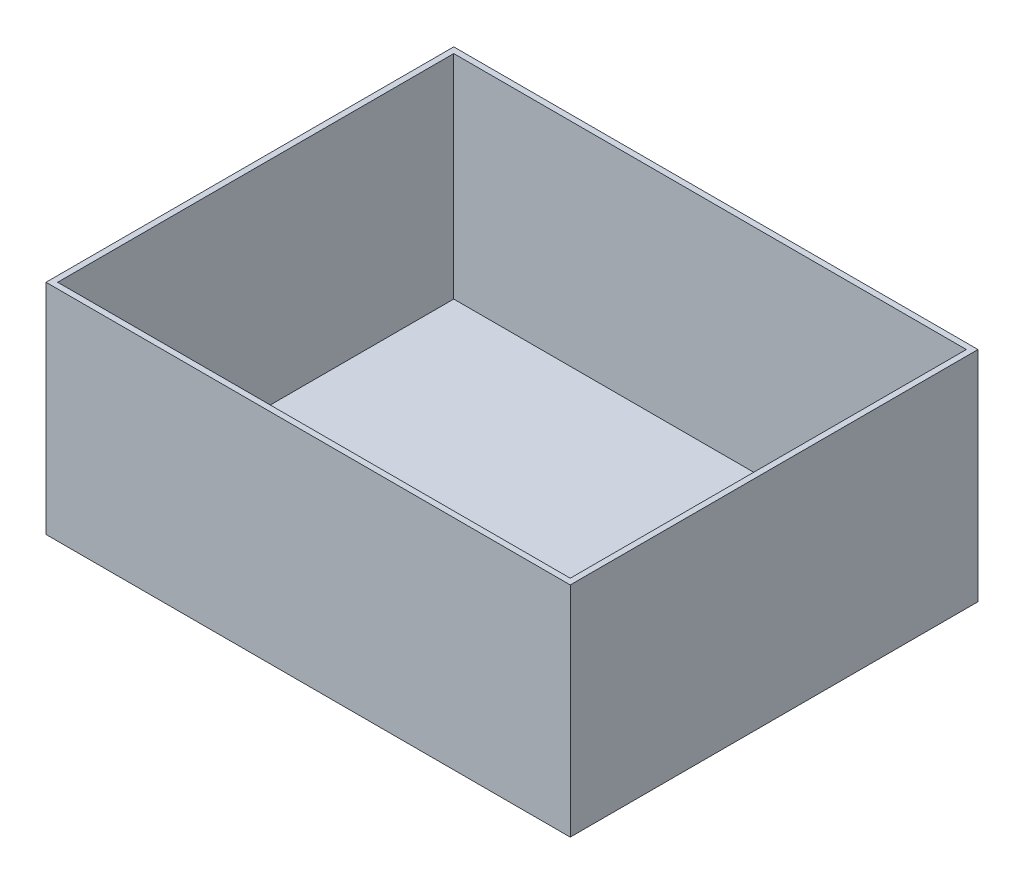
ISO-10303-21;
HEADER;
FILE_DESCRIPTION(('STEP AP214'),'2;1');
FILE_NAME('part.step','',(''),(''),'','','');
FILE_SCHEMA(('AUTOMOTIVE_DESIGN { 1 0 10303 214 1 1 1 1 }'));
ENDSEC;
DATA;
#1=APPLICATION_CONTEXT('core data for automotive mechanical design processes');
#2=APPLICATION_PROTOCOL_DEFINITION('international standard','automotive_design',2000,#1);
#3=PRODUCT_CONTEXT('',#1,'mechanical');
#4=PRODUCT('Part','Part','',(#3));
#5=PRODUCT_RELATED_PRODUCT_CATEGORY('part','',(#4));
#6=PRODUCT_DEFINITION_FORMATION('','',#4);
#7=PRODUCT_DEFINITION_CONTEXT('part definition',#1,'design');
#8=PRODUCT_DEFINITION('design','',#6,#7);
#9=PRODUCT_DEFINITION_SHAPE('','',#8);
#10=(LENGTH_UNIT() NAMED_UNIT(*) SI_UNIT(.MILLI.,.METRE.));
#11=(NAMED_UNIT(*) PLANE_ANGLE_UNIT() SI_UNIT($,.RADIAN.));
#12=(NAMED_UNIT(*) SI_UNIT($,.STERADIAN.) SOLID_ANGLE_UNIT());
#13=UNCERTAINTY_MEASURE_WITH_UNIT(LENGTH_MEASURE(1.E-05),#10,'distance_accuracy_value','');
#14=(GEOMETRIC_REPRESENTATION_CONTEXT(3) GLOBAL_UNCERTAINTY_ASSIGNED_CONTEXT((#13)) GLOBAL_UNIT_ASSIGNED_CONTEXT((#10,
#11,#12)) REPRESENTATION_CONTEXT('',''));
#15=CARTESIAN_POINT('',(0.,0.,0.));
#16=DIRECTION('',(0.,0.,1.));
#17=DIRECTION('',(1.,0.,0.));
#18=AXIS2_PLACEMENT_3D('',#15,#16,#17);
#19=CARTESIAN_POINT('',(114.3,95.25,-88.9));
#20=DIRECTION('',(-1.,0.,0.));
#21=DIRECTION('',(0.,0.,1.));
#22=AXIS2_PLACEMENT_3D('',#19,#20,#21);
#23=PLANE('',#22);
#24=DIRECTION('',(0.,0.,-1.));
#25=VECTOR('',#24,1.);
#26=CARTESIAN_POINT('',(114.3,0.,-88.9));
#27=LINE('',#26,#25);
#28=CARTESIAN_POINT('',(114.3,0.,88.9));
#29=VERTEX_POINT('',#28);
#30=CARTESIAN_POINT('',(114.3,0.,-88.9));
#31=VERTEX_POINT('',#30);
#32=EDGE_CURVE('E153',#29,#31,#27,.T.);
#33=ORIENTED_EDGE('',*,*,#32,.T.);
#34=DIRECTION('',(0.,-1.,0.));
#35=VECTOR('',#34,1.);
#36=CARTESIAN_POINT('',(114.3,95.25,-88.9));
#37=LINE('',#36,#35);
#38=CARTESIAN_POINT('',(114.3,95.25,-88.9));
#39=VERTEX_POINT('',#38);
#40=EDGE_CURVE('E11',#39,#31,#37,.T.);
#41=ORIENTED_EDGE('',*,*,#40,.F.);
#42=DIRECTION('',(0.,0.,-1.));
#43=VECTOR('',#42,1.);
#44=CARTESIAN_POINT('',(114.3,95.25,-88.9));
#45=LINE('',#44,#43);
#46=CARTESIAN_POINT('',(114.3,95.25,88.9));
#47=VERTEX_POINT('',#46);
#48=EDGE_CURVE('E146',#47,#39,#45,.T.);
#49=ORIENTED_EDGE('',*,*,#48,.F.);
#50=DIRECTION('',(0.,-1.,0.));
#51=VECTOR('',#50,1.);
#52=CARTESIAN_POINT('',(114.3,95.25,88.9));
#53=LINE('',#52,#51);
#54=EDGE_CURVE('E152',#47,#29,#53,.T.);
#55=ORIENTED_EDGE('',*,*,#54,.T.);
#56=EDGE_LOOP('',(#33,#41,#49,#55));
#57=FACE_BOUND('',#56,.T.);
#58=ADVANCED_FACE('F39',(#57),#23,.F.);
#59=CARTESIAN_POINT('',(-114.3,95.25,-88.9));
#60=DIRECTION('',(0.,0.,1.));
#61=DIRECTION('',(1.,0.,0.));
#62=AXIS2_PLACEMENT_3D('',#59,#60,#61);
#63=PLANE('',#62);
#64=DIRECTION('',(-1.,0.,0.));
#65=VECTOR('',#64,1.);
#66=CARTESIAN_POINT('',(-114.3,0.,-88.9));
#67=LINE('',#66,#65);
#68=CARTESIAN_POINT('',(-114.3,0.,-88.9));
#69=VERTEX_POINT('',#68);
#70=EDGE_CURVE('E156',#31,#69,#67,.T.);
#71=ORIENTED_EDGE('',*,*,#70,.T.);
#72=DIRECTION('',(0.,-1.,0.));
#73=VECTOR('',#72,1.);
#74=CARTESIAN_POINT('',(-114.3,95.25,-88.9));
#75=LINE('',#74,#73);
#76=CARTESIAN_POINT('',(-114.3,95.25,-88.9));
#77=VERTEX_POINT('',#76);
#78=EDGE_CURVE('E46',#77,#69,#75,.T.);
#79=ORIENTED_EDGE('',*,*,#78,.F.);
#80=DIRECTION('',(-1.,0.,0.));
#81=VECTOR('',#80,1.);
#82=CARTESIAN_POINT('',(-114.3,95.25,-88.9));
#83=LINE('',#82,#81);
#84=EDGE_CURVE('E90',#39,#77,#83,.T.);
#85=ORIENTED_EDGE('',*,*,#84,.F.);
#86=ORIENTED_EDGE('',*,*,#40,.T.);
#87=EDGE_LOOP('',(#71,#79,#85,#86));
#88=FACE_BOUND('',#87,.T.);
#89=ADVANCED_FACE('F186',(#88),#63,.F.);
#90=CARTESIAN_POINT('',(-114.3,95.25,-88.9));
#91=DIRECTION('',(1.,0.,0.));
#92=DIRECTION('',(0.,0.,-1.));
#93=AXIS2_PLACEMENT_3D('',#90,#91,#92);
#94=PLANE('',#93);
#95=DIRECTION('',(0.,0.,1.));
#96=VECTOR('',#95,1.);
#97=CARTESIAN_POINT('',(-114.3,0.,-88.9));
#98=LINE('',#97,#96);
#99=CARTESIAN_POINT('',(-114.3,0.,88.9));
#100=VERTEX_POINT('',#99);
#101=EDGE_CURVE('E158',#69,#100,#98,.T.);
#102=ORIENTED_EDGE('',*,*,#101,.T.);
#103=DIRECTION('',(0.,-1.,0.));
#104=VECTOR('',#103,1.);
#105=CARTESIAN_POINT('',(-114.3,95.25,88.9));
#106=LINE('',#105,#104);
#107=CARTESIAN_POINT('',(-114.3,95.25,88.9));
#108=VERTEX_POINT('',#107);
#109=EDGE_CURVE('E162',#108,#100,#106,.T.);
#110=ORIENTED_EDGE('',*,*,#109,.F.);
#111=DIRECTION('',(0.,0.,1.));
#112=VECTOR('',#111,1.);
#113=CARTESIAN_POINT('',(-114.3,95.25,-88.9));
#114=LINE('',#113,#112);
#115=EDGE_CURVE('E149',#77,#108,#114,.T.);
#116=ORIENTED_EDGE('',*,*,#115,.F.);
#117=ORIENTED_EDGE('',*,*,#78,.T.);
#118=EDGE_LOOP('',(#102,#110,#116,#117));
#119=FACE_BOUND('',#118,.T.);
#120=ADVANCED_FACE('F167',(#119),#94,.F.);
#121=CARTESIAN_POINT('',(-114.3,95.25,88.9));
#122=DIRECTION('',(0.,0.,-1.));
#123=DIRECTION('',(-1.,0.,0.));
#124=AXIS2_PLACEMENT_3D('',#121,#122,#123);
#125=PLANE('',#124);
#126=DIRECTION('',(1.,0.,0.));
#127=VECTOR('',#126,1.);
#128=CARTESIAN_POINT('',(-114.3,0.,88.9));
#129=LINE('',#128,#127);
#130=EDGE_CURVE('E83',#100,#29,#129,.T.);
#131=ORIENTED_EDGE('',*,*,#130,.T.);
#132=ORIENTED_EDGE('',*,*,#54,.F.);
#133=DIRECTION('',(1.,0.,0.));
#134=VECTOR('',#133,1.);
#135=CARTESIAN_POINT('',(-114.3,95.25,88.9));
#136=LINE('',#135,#134);
#137=EDGE_CURVE('E62',#108,#47,#136,.T.);
#138=ORIENTED_EDGE('',*,*,#137,.F.);
#139=ORIENTED_EDGE('',*,*,#109,.T.);
#140=EDGE_LOOP('',(#131,#132,#138,#139));
#141=FACE_BOUND('',#140,.T.);
#142=ADVANCED_FACE('F175',(#141),#125,.F.);
#143=CARTESIAN_POINT('',(0.,95.25,0.));
#144=DIRECTION('',(0.,1.,0.));
#145=DIRECTION('',(0.,0.,1.));
#146=AXIS2_PLACEMENT_3D('',#143,#144,#145);
#147=PLANE('',#146);
#148=DIRECTION('',(0.,0.,-1.));
#149=VECTOR('',#148,1.);
#150=CARTESIAN_POINT('',(111.76,95.25,-88.9));
#151=LINE('',#150,#149);
#152=CARTESIAN_POINT('',(111.76,95.25,86.36));
#153=VERTEX_POINT('',#152);
#154=CARTESIAN_POINT('',(111.76,95.25,-86.36));
#155=VERTEX_POINT('',#154);
#156=EDGE_CURVE('E135',#153,#155,#151,.T.);
#157=ORIENTED_EDGE('',*,*,#156,.F.);
#158=DIRECTION('',(1.,0.,0.));
#159=VECTOR('',#158,1.);
#160=CARTESIAN_POINT('',(-114.3,95.25,86.36));
#161=LINE('',#160,#159);
#162=CARTESIAN_POINT('',(-111.76,95.25,86.36));
#163=VERTEX_POINT('',#162);
#164=EDGE_CURVE('E144',#163,#153,#161,.T.);
#165=ORIENTED_EDGE('',*,*,#164,.F.);
#166=DIRECTION('',(0.,0.,1.));
#167=VECTOR('',#166,1.);
#168=CARTESIAN_POINT('',(-111.76,95.25,-88.9));
#169=LINE('',#168,#167);
#170=CARTESIAN_POINT('',(-111.76,95.25,-86.36));
#171=VERTEX_POINT('',#170);
#172=EDGE_CURVE('E142',#171,#163,#169,.T.);
#173=ORIENTED_EDGE('',*,*,#172,.F.);
#174=DIRECTION('',(-1.,0.,0.));
#175=VECTOR('',#174,1.);
#176=CARTESIAN_POINT('',(-114.3,95.25,-86.36));
#177=LINE('',#176,#175);
#178=EDGE_CURVE('E127',#155,#171,#177,.T.);
#179=ORIENTED_EDGE('',*,*,#178,.F.);
#180=EDGE_LOOP('',(#157,#165,#173,#179));
#181=FACE_BOUND('',#180,.T.);
#182=ORIENTED_EDGE('',*,*,#48,.T.);
#183=ORIENTED_EDGE('',*,*,#84,.T.);
#184=ORIENTED_EDGE('',*,*,#115,.T.);
#185=ORIENTED_EDGE('',*,*,#137,.T.);
#186=EDGE_LOOP('',(#182,#183,#184,#185));
#187=FACE_BOUND('',#186,.T.);
#188=ADVANCED_FACE('F177',(#181,#187),#147,.T.);
#189=CARTESIAN_POINT('',(0.,0.,0.));
#190=DIRECTION('',(0.,1.,0.));
#191=DIRECTION('',(0.,0.,1.));
#192=AXIS2_PLACEMENT_3D('',#189,#190,#191);
#193=PLANE('',#192);
#194=ORIENTED_EDGE('',*,*,#32,.F.);
#195=ORIENTED_EDGE('',*,*,#130,.F.);
#196=ORIENTED_EDGE('',*,*,#101,.F.);
#197=ORIENTED_EDGE('',*,*,#70,.F.);
#198=EDGE_LOOP('',(#194,#195,#196,#197));
#199=FACE_BOUND('',#198,.T.);
#200=ADVANCED_FACE('F171',(#199),#193,.F.);
#201=CARTESIAN_POINT('',(111.76,95.25,-88.9));
#202=DIRECTION('',(-1.,0.,0.));
#203=DIRECTION('',(0.,0.,1.));
#204=AXIS2_PLACEMENT_3D('',#201,#202,#203);
#205=PLANE('',#204);
#206=DIRECTION('',(0.,0.,-1.));
#207=VECTOR('',#206,1.);
#208=CARTESIAN_POINT('',(111.76,2.54,-88.9));
#209=LINE('',#208,#207);
#210=CARTESIAN_POINT('',(111.76,2.54,86.36));
#211=VERTEX_POINT('',#210);
#212=CARTESIAN_POINT('',(111.76,2.54,-86.36));
#213=VERTEX_POINT('',#212);
#214=EDGE_CURVE('E118',#211,#213,#209,.T.);
#215=ORIENTED_EDGE('',*,*,#214,.F.);
#216=DIRECTION('',(0.,-1.,0.));
#217=VECTOR('',#216,1.);
#218=CARTESIAN_POINT('',(111.76,95.25,86.36));
#219=LINE('',#218,#217);
#220=EDGE_CURVE('E138',#153,#211,#219,.T.);
#221=ORIENTED_EDGE('',*,*,#220,.F.);
#222=ORIENTED_EDGE('',*,*,#156,.T.);
#223=DIRECTION('',(0.,-1.,0.));
#224=VECTOR('',#223,1.);
#225=CARTESIAN_POINT('',(111.76,95.25,-86.36));
#226=LINE('',#225,#224);
#227=EDGE_CURVE('E130',#155,#213,#226,.T.);
#228=ORIENTED_EDGE('',*,*,#227,.T.);
#229=EDGE_LOOP('',(#215,#221,#222,#228));
#230=FACE_BOUND('',#229,.T.);
#231=ADVANCED_FACE('F220',(#230),#205,.T.);
#232=CARTESIAN_POINT('',(-114.3,95.25,-86.36));
#233=DIRECTION('',(0.,0.,1.));
#234=DIRECTION('',(1.,0.,0.));
#235=AXIS2_PLACEMENT_3D('',#232,#233,#234);
#236=PLANE('',#235);
#237=DIRECTION('',(-1.,0.,0.));
#238=VECTOR('',#237,1.);
#239=CARTESIAN_POINT('',(-114.3,2.54,-86.36));
#240=LINE('',#239,#238);
#241=CARTESIAN_POINT('',(-111.76,2.54,-86.36));
#242=VERTEX_POINT('',#241);
#243=EDGE_CURVE('E112',#213,#242,#240,.T.);
#244=ORIENTED_EDGE('',*,*,#243,.F.);
#245=ORIENTED_EDGE('',*,*,#227,.F.);
#246=ORIENTED_EDGE('',*,*,#178,.T.);
#247=DIRECTION('',(0.,-1.,0.));
#248=VECTOR('',#247,1.);
#249=CARTESIAN_POINT('',(-111.76,95.25,-86.36));
#250=LINE('',#249,#248);
#251=EDGE_CURVE('E124',#171,#242,#250,.T.);
#252=ORIENTED_EDGE('',*,*,#251,.T.);
#253=EDGE_LOOP('',(#244,#245,#246,#252));
#254=FACE_BOUND('',#253,.T.);
#255=ADVANCED_FACE('F125',(#254),#236,.T.);
#256=CARTESIAN_POINT('',(-111.76,95.25,-88.9));
#257=DIRECTION('',(1.,0.,0.));
#258=DIRECTION('',(0.,0.,-1.));
#259=AXIS2_PLACEMENT_3D('',#256,#257,#258);
#260=PLANE('',#259);
#261=DIRECTION('',(0.,0.,1.));
#262=VECTOR('',#261,1.);
#263=CARTESIAN_POINT('',(-111.76,2.54,-88.9));
#264=LINE('',#263,#262);
#265=CARTESIAN_POINT('',(-111.76,2.54,86.36));
#266=VERTEX_POINT('',#265);
#267=EDGE_CURVE('E116',#242,#266,#264,.T.);
#268=ORIENTED_EDGE('',*,*,#267,.F.);
#269=ORIENTED_EDGE('',*,*,#251,.F.);
#270=ORIENTED_EDGE('',*,*,#172,.T.);
#271=DIRECTION('',(0.,-1.,0.));
#272=VECTOR('',#271,1.);
#273=CARTESIAN_POINT('',(-111.76,95.25,86.36));
#274=LINE('',#273,#272);
#275=EDGE_CURVE('E53',#163,#266,#274,.T.);
#276=ORIENTED_EDGE('',*,*,#275,.T.);
#277=EDGE_LOOP('',(#268,#269,#270,#276));
#278=FACE_BOUND('',#277,.T.);
#279=ADVANCED_FACE('F132',(#278),#260,.T.);
#280=CARTESIAN_POINT('',(-114.3,95.25,86.36));
#281=DIRECTION('',(0.,0.,-1.));
#282=DIRECTION('',(-1.,0.,0.));
#283=AXIS2_PLACEMENT_3D('',#280,#281,#282);
#284=PLANE('',#283);
#285=DIRECTION('',(1.,0.,0.));
#286=VECTOR('',#285,1.);
#287=CARTESIAN_POINT('',(-114.3,2.54,86.36));
#288=LINE('',#287,#286);
#289=EDGE_CURVE('E133',#266,#211,#288,.T.);
#290=ORIENTED_EDGE('',*,*,#289,.F.);
#291=ORIENTED_EDGE('',*,*,#275,.F.);
#292=ORIENTED_EDGE('',*,*,#164,.T.);
#293=ORIENTED_EDGE('',*,*,#220,.T.);
#294=EDGE_LOOP('',(#290,#291,#292,#293));
#295=FACE_BOUND('',#294,.T.);
#296=ADVANCED_FACE('F244',(#295),#284,.T.);
#297=CARTESIAN_POINT('',(0.,2.54,0.));
#298=DIRECTION('',(0.,1.,0.));
#299=DIRECTION('',(0.,0.,1.));
#300=AXIS2_PLACEMENT_3D('',#297,#298,#299);
#301=PLANE('',#300);
#302=ORIENTED_EDGE('',*,*,#214,.T.);
#303=ORIENTED_EDGE('',*,*,#243,.T.);
#304=ORIENTED_EDGE('',*,*,#267,.T.);
#305=ORIENTED_EDGE('',*,*,#289,.T.);
#306=EDGE_LOOP('',(#302,#303,#304,#305));
#307=FACE_BOUND('',#306,.T.);
#308=ADVANCED_FACE('F114',(#307),#301,.T.);
#309=CLOSED_SHELL('',(#58,#89,#120,#142,#188,#200,#231,#255,#279,#296,#308));
#310=MANIFOLD_SOLID_BREP('B2',#309);
#311=ADVANCED_BREP_SHAPE_REPRESENTATION('',(#18,#310),#14);
#312=SHAPE_DEFINITION_REPRESENTATION(#9,#311);
ENDSEC;
END-ISO-10303-21;
